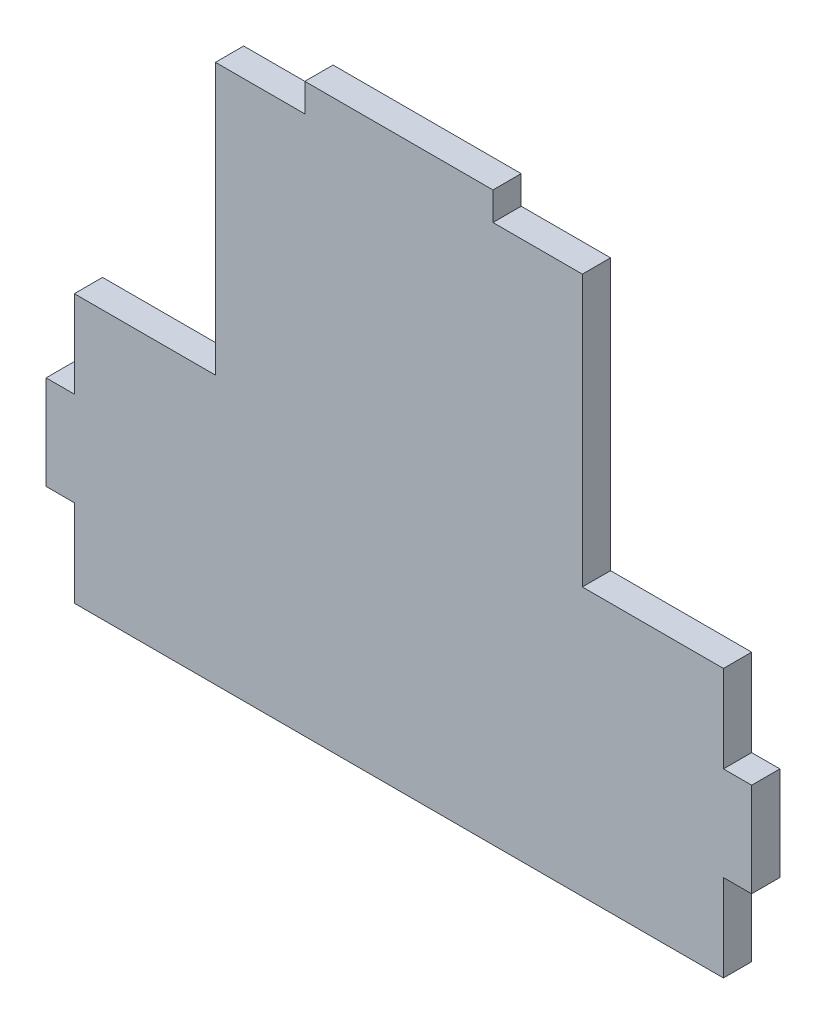
ISO-10303-21;
HEADER;
FILE_DESCRIPTION(('STEP AP214'),'2;1');
FILE_NAME('part.step','',(''),(''),'','','');
FILE_SCHEMA(('AUTOMOTIVE_DESIGN { 1 0 10303 214 1 1 1 1 }'));
ENDSEC;
DATA;
#1=APPLICATION_CONTEXT('core data for automotive mechanical design processes');
#2=APPLICATION_PROTOCOL_DEFINITION('international standard','automotive_design',2000,#1);
#3=PRODUCT_CONTEXT('',#1,'mechanical');
#4=PRODUCT('Part','Part','',(#3));
#5=PRODUCT_RELATED_PRODUCT_CATEGORY('part','',(#4));
#6=PRODUCT_DEFINITION_FORMATION('','',#4);
#7=PRODUCT_DEFINITION_CONTEXT('part definition',#1,'design');
#8=PRODUCT_DEFINITION('design','',#6,#7);
#9=PRODUCT_DEFINITION_SHAPE('','',#8);
#10=(LENGTH_UNIT() NAMED_UNIT(*) SI_UNIT(.MILLI.,.METRE.));
#11=(NAMED_UNIT(*) PLANE_ANGLE_UNIT() SI_UNIT($,.RADIAN.));
#12=(NAMED_UNIT(*) SI_UNIT($,.STERADIAN.) SOLID_ANGLE_UNIT());
#13=UNCERTAINTY_MEASURE_WITH_UNIT(LENGTH_MEASURE(1.E-05),#10,'distance_accuracy_value','');
#14=(GEOMETRIC_REPRESENTATION_CONTEXT(3) GLOBAL_UNCERTAINTY_ASSIGNED_CONTEXT((#13)) GLOBAL_UNIT_ASSIGNED_CONTEXT((#10,
#11,#12)) REPRESENTATION_CONTEXT('',''));
#15=CARTESIAN_POINT('',(0.,0.,0.));
#16=DIRECTION('',(0.,0.,1.));
#17=DIRECTION('',(1.,0.,0.));
#18=AXIS2_PLACEMENT_3D('',#15,#16,#17);
#19=CARTESIAN_POINT('',(18.,-3.,3.));
#20=DIRECTION('',(0.,-1.,0.));
#21=DIRECTION('',(0.,0.,-1.));
#22=AXIS2_PLACEMENT_3D('',#19,#20,#21);
#23=PLANE('',#22);
#24=DIRECTION('',(0.,0.,1.));
#25=VECTOR('',#24,1.);
#26=CARTESIAN_POINT('',(27.5,-3.,0.));
#27=LINE('',#26,#25);
#28=CARTESIAN_POINT('',(27.5,-3.,0.));
#29=VERTEX_POINT('',#28);
#30=CARTESIAN_POINT('',(27.5,-3.,3.));
#31=VERTEX_POINT('',#30);
#32=EDGE_CURVE('E180',#29,#31,#27,.T.);
#33=ORIENTED_EDGE('',*,*,#32,.F.);
#34=DIRECTION('',(-1.,0.,0.));
#35=VECTOR('',#34,1.);
#36=CARTESIAN_POINT('',(18.,-3.,0.));
#37=LINE('',#36,#35);
#38=CARTESIAN_POINT('',(18.,-3.,0.));
#39=VERTEX_POINT('',#38);
#40=EDGE_CURVE('E194',#29,#39,#37,.T.);
#41=ORIENTED_EDGE('',*,*,#40,.T.);
#42=DIRECTION('',(0.,0.,-1.));
#43=VECTOR('',#42,1.);
#44=CARTESIAN_POINT('',(18.,-3.,3.));
#45=LINE('',#44,#43);
#46=CARTESIAN_POINT('',(18.,-3.,3.));
#47=VERTEX_POINT('',#46);
#48=EDGE_CURVE('E217',#47,#39,#45,.T.);
#49=ORIENTED_EDGE('',*,*,#48,.F.);
#50=DIRECTION('',(-1.,0.,0.));
#51=VECTOR('',#50,1.);
#52=CARTESIAN_POINT('',(18.,-3.,3.));
#53=LINE('',#52,#51);
#54=EDGE_CURVE('E196',#31,#47,#53,.T.);
#55=ORIENTED_EDGE('',*,*,#54,.F.);
#56=EDGE_LOOP('',(#33,#41,#49,#55));
#57=FACE_BOUND('',#56,.T.);
#58=ADVANCED_FACE('F39',(#57),#23,.F.);
#59=CARTESIAN_POINT('',(3.,-31.8,3.));
#60=DIRECTION('',(1.,0.,0.));
#61=DIRECTION('',(0.,0.,-1.));
#62=AXIS2_PLACEMENT_3D('',#59,#60,#61);
#63=PLANE('',#62);
#64=DIRECTION('',(0.,0.,1.));
#65=VECTOR('',#64,1.);
#66=CARTESIAN_POINT('',(3.,-51.05,0.));
#67=LINE('',#66,#65);
#68=CARTESIAN_POINT('',(3.,-51.05,0.));
#69=VERTEX_POINT('',#68);
#70=CARTESIAN_POINT('',(3.,-51.05,3.));
#71=VERTEX_POINT('',#70);
#72=EDGE_CURVE('E402',#69,#71,#67,.T.);
#73=ORIENTED_EDGE('',*,*,#72,.F.);
#74=DIRECTION('',(0.,-1.,0.));
#75=VECTOR('',#74,1.);
#76=CARTESIAN_POINT('',(3.,-31.8,0.));
#77=LINE('',#76,#75);
#78=CARTESIAN_POINT('',(3.,-60.3,0.));
#79=VERTEX_POINT('',#78);
#80=EDGE_CURVE('E259',#69,#79,#77,.T.);
#81=ORIENTED_EDGE('',*,*,#80,.T.);
#82=DIRECTION('',(0.,0.,-1.));
#83=VECTOR('',#82,1.);
#84=CARTESIAN_POINT('',(3.,-60.3,3.));
#85=LINE('',#84,#83);
#86=CARTESIAN_POINT('',(3.,-60.3,3.));
#87=VERTEX_POINT('',#86);
#88=EDGE_CURVE('E237',#87,#79,#85,.T.);
#89=ORIENTED_EDGE('',*,*,#88,.F.);
#90=DIRECTION('',(0.,-1.,0.));
#91=VECTOR('',#90,1.);
#92=CARTESIAN_POINT('',(3.,-31.8,3.));
#93=LINE('',#92,#91);
#94=EDGE_CURVE('E330',#71,#87,#93,.T.);
#95=ORIENTED_EDGE('',*,*,#94,.F.);
#96=EDGE_LOOP('',(#73,#81,#89,#95));
#97=FACE_BOUND('',#96,.T.);
#98=ADVANCED_FACE('F357',(#97),#63,.F.);
#99=CARTESIAN_POINT('',(72.,-60.3,3.));
#100=DIRECTION('',(-1.,0.,0.));
#101=DIRECTION('',(0.,0.,1.));
#102=AXIS2_PLACEMENT_3D('',#99,#100,#101);
#103=PLANE('',#102);
#104=DIRECTION('',(0.,0.,1.));
#105=VECTOR('',#104,1.);
#106=CARTESIAN_POINT('',(72.,-41.05,0.));
#107=LINE('',#106,#105);
#108=CARTESIAN_POINT('',(72.,-41.05,0.));
#109=VERTEX_POINT('',#108);
#110=CARTESIAN_POINT('',(72.,-41.05,3.));
#111=VERTEX_POINT('',#110);
#112=EDGE_CURVE('E299',#109,#111,#107,.T.);
#113=ORIENTED_EDGE('',*,*,#112,.F.);
#114=DIRECTION('',(0.,1.,0.));
#115=VECTOR('',#114,1.);
#116=CARTESIAN_POINT('',(72.,-60.3,0.));
#117=LINE('',#116,#115);
#118=CARTESIAN_POINT('',(72.,-31.8,0.));
#119=VERTEX_POINT('',#118);
#120=EDGE_CURVE('E263',#109,#119,#117,.T.);
#121=ORIENTED_EDGE('',*,*,#120,.T.);
#122=DIRECTION('',(0.,0.,-1.));
#123=VECTOR('',#122,1.);
#124=CARTESIAN_POINT('',(72.,-31.8,3.));
#125=LINE('',#124,#123);
#126=CARTESIAN_POINT('',(72.,-31.8,3.));
#127=VERTEX_POINT('',#126);
#128=EDGE_CURVE('E229',#127,#119,#125,.T.);
#129=ORIENTED_EDGE('',*,*,#128,.F.);
#130=DIRECTION('',(0.,1.,0.));
#131=VECTOR('',#130,1.);
#132=CARTESIAN_POINT('',(72.,-60.3,3.));
#133=LINE('',#132,#131);
#134=EDGE_CURVE('E336',#111,#127,#133,.T.);
#135=ORIENTED_EDGE('',*,*,#134,.F.);
#136=EDGE_LOOP('',(#113,#121,#129,#135));
#137=FACE_BOUND('',#136,.T.);
#138=ADVANCED_FACE('F361',(#137),#103,.F.);
#139=CARTESIAN_POINT('',(18.,-3.,3.));
#140=DIRECTION('',(1.,0.,0.));
#141=DIRECTION('',(0.,1.,0.));
#142=AXIS2_PLACEMENT_3D('',#139,#140,#141);
#143=PLANE('',#142);
#144=DIRECTION('',(0.,-1.,0.));
#145=VECTOR('',#144,1.);
#146=CARTESIAN_POINT('',(18.,-3.,0.));
#147=LINE('',#146,#145);
#148=CARTESIAN_POINT('',(18.,-31.8,0.));
#149=VERTEX_POINT('',#148);
#150=EDGE_CURVE('E204',#39,#149,#147,.T.);
#151=ORIENTED_EDGE('',*,*,#150,.T.);
#152=DIRECTION('',(0.,0.,-1.));
#153=VECTOR('',#152,1.);
#154=CARTESIAN_POINT('',(18.,-31.8,3.));
#155=LINE('',#154,#153);
#156=CARTESIAN_POINT('',(18.,-31.8,3.));
#157=VERTEX_POINT('',#156);
#158=EDGE_CURVE('E11',#157,#149,#155,.T.);
#159=ORIENTED_EDGE('',*,*,#158,.F.);
#160=DIRECTION('',(0.,-1.,0.));
#161=VECTOR('',#160,1.);
#162=CARTESIAN_POINT('',(18.,-3.,3.));
#163=LINE('',#162,#161);
#164=EDGE_CURVE('E212',#47,#157,#163,.T.);
#165=ORIENTED_EDGE('',*,*,#164,.F.);
#166=ORIENTED_EDGE('',*,*,#48,.T.);
#167=EDGE_LOOP('',(#151,#159,#165,#166));
#168=FACE_BOUND('',#167,.T.);
#169=ADVANCED_FACE('F41',(#168),#143,.F.);
#170=CARTESIAN_POINT('',(18.,-31.8,3.));
#171=DIRECTION('',(0.,-1.,0.));
#172=DIRECTION('',(0.,0.,-1.));
#173=AXIS2_PLACEMENT_3D('',#170,#171,#172);
#174=PLANE('',#173);
#175=DIRECTION('',(-1.,0.,0.));
#176=VECTOR('',#175,1.);
#177=CARTESIAN_POINT('',(18.,-31.8,0.));
#178=LINE('',#177,#176);
#179=CARTESIAN_POINT('',(3.,-31.8,0.));
#180=VERTEX_POINT('',#179);
#181=EDGE_CURVE('E253',#149,#180,#178,.T.);
#182=ORIENTED_EDGE('',*,*,#181,.T.);
#183=DIRECTION('',(0.,0.,-1.));
#184=VECTOR('',#183,1.);
#185=CARTESIAN_POINT('',(3.,-31.8,3.));
#186=LINE('',#185,#184);
#187=CARTESIAN_POINT('',(3.,-31.8,3.));
#188=VERTEX_POINT('',#187);
#189=EDGE_CURVE('E48',#188,#180,#186,.T.);
#190=ORIENTED_EDGE('',*,*,#189,.F.);
#191=DIRECTION('',(-1.,0.,0.));
#192=VECTOR('',#191,1.);
#193=CARTESIAN_POINT('',(18.,-31.8,3.));
#194=LINE('',#193,#192);
#195=EDGE_CURVE('E327',#157,#188,#194,.T.);
#196=ORIENTED_EDGE('',*,*,#195,.F.);
#197=ORIENTED_EDGE('',*,*,#158,.T.);
#198=EDGE_LOOP('',(#182,#190,#196,#197));
#199=FACE_BOUND('',#198,.T.);
#200=ADVANCED_FACE('F377',(#199),#174,.F.);
#201=CARTESIAN_POINT('',(3.,-41.05,0.));
#202=VERTEX_POINT('',#201);
#203=EDGE_CURVE('E248',#180,#202,#77,.T.);
#204=ORIENTED_EDGE('',*,*,#203,.T.);
#205=DIRECTION('',(0.,0.,1.));
#206=VECTOR('',#205,1.);
#207=CARTESIAN_POINT('',(3.,-41.05,0.));
#208=LINE('',#207,#206);
#209=CARTESIAN_POINT('',(3.,-41.05,3.));
#210=VERTEX_POINT('',#209);
#211=EDGE_CURVE('E412',#202,#210,#208,.T.);
#212=ORIENTED_EDGE('',*,*,#211,.T.);
#213=EDGE_CURVE('E250',#188,#210,#93,.T.);
#214=ORIENTED_EDGE('',*,*,#213,.F.);
#215=ORIENTED_EDGE('',*,*,#189,.T.);
#216=EDGE_LOOP('',(#204,#212,#214,#215));
#217=FACE_BOUND('',#216,.T.);
#218=ADVANCED_FACE('F247',(#217),#63,.F.);
#219=CARTESIAN_POINT('',(3.,-60.3,3.));
#220=DIRECTION('',(0.,1.,0.));
#221=DIRECTION('',(0.,0.,1.));
#222=AXIS2_PLACEMENT_3D('',#219,#220,#221);
#223=PLANE('',#222);
#224=DIRECTION('',(1.,0.,0.));
#225=VECTOR('',#224,1.);
#226=CARTESIAN_POINT('',(3.,-60.3,0.));
#227=LINE('',#226,#225);
#228=CARTESIAN_POINT('',(72.,-60.3,0.));
#229=VERTEX_POINT('',#228);
#230=EDGE_CURVE('E258',#79,#229,#227,.T.);
#231=ORIENTED_EDGE('',*,*,#230,.T.);
#232=DIRECTION('',(0.,0.,-1.));
#233=VECTOR('',#232,1.);
#234=CARTESIAN_POINT('',(72.,-60.3,3.));
#235=LINE('',#234,#233);
#236=CARTESIAN_POINT('',(72.,-60.3,3.));
#237=VERTEX_POINT('',#236);
#238=EDGE_CURVE('E233',#237,#229,#235,.T.);
#239=ORIENTED_EDGE('',*,*,#238,.F.);
#240=DIRECTION('',(1.,0.,0.));
#241=VECTOR('',#240,1.);
#242=CARTESIAN_POINT('',(3.,-60.3,3.));
#243=LINE('',#242,#241);
#244=EDGE_CURVE('E333',#87,#237,#243,.T.);
#245=ORIENTED_EDGE('',*,*,#244,.F.);
#246=ORIENTED_EDGE('',*,*,#88,.T.);
#247=EDGE_LOOP('',(#231,#239,#245,#246));
#248=FACE_BOUND('',#247,.T.);
#249=ADVANCED_FACE('F372',(#248),#223,.F.);
#250=CARTESIAN_POINT('',(72.,-51.05,0.));
#251=VERTEX_POINT('',#250);
#252=EDGE_CURVE('E268',#229,#251,#117,.T.);
#253=ORIENTED_EDGE('',*,*,#252,.T.);
#254=DIRECTION('',(0.,0.,1.));
#255=VECTOR('',#254,1.);
#256=CARTESIAN_POINT('',(72.,-51.05,0.));
#257=LINE('',#256,#255);
#258=CARTESIAN_POINT('',(72.,-51.05,3.));
#259=VERTEX_POINT('',#258);
#260=EDGE_CURVE('E319',#251,#259,#257,.T.);
#261=ORIENTED_EDGE('',*,*,#260,.T.);
#262=EDGE_CURVE('E337',#237,#259,#133,.T.);
#263=ORIENTED_EDGE('',*,*,#262,.F.);
#264=ORIENTED_EDGE('',*,*,#238,.T.);
#265=EDGE_LOOP('',(#253,#261,#263,#264));
#266=FACE_BOUND('',#265,.T.);
#267=ADVANCED_FACE('F369',(#266),#103,.F.);
#268=CARTESIAN_POINT('',(72.,-31.8,3.));
#269=DIRECTION('',(0.,-1.,0.));
#270=DIRECTION('',(0.,0.,-1.));
#271=AXIS2_PLACEMENT_3D('',#268,#269,#270);
#272=PLANE('',#271);
#273=DIRECTION('',(-1.,0.,0.));
#274=VECTOR('',#273,1.);
#275=CARTESIAN_POINT('',(72.,-31.8,0.));
#276=LINE('',#275,#274);
#277=CARTESIAN_POINT('',(57.,-31.8,0.));
#278=VERTEX_POINT('',#277);
#279=EDGE_CURVE('E213',#119,#278,#276,.T.);
#280=ORIENTED_EDGE('',*,*,#279,.T.);
#281=DIRECTION('',(0.,0.,-1.));
#282=VECTOR('',#281,1.);
#283=CARTESIAN_POINT('',(57.,-31.8,3.));
#284=LINE('',#283,#282);
#285=CARTESIAN_POINT('',(57.,-31.8,3.));
#286=VERTEX_POINT('',#285);
#287=EDGE_CURVE('E225',#286,#278,#284,.T.);
#288=ORIENTED_EDGE('',*,*,#287,.F.);
#289=DIRECTION('',(-1.,0.,0.));
#290=VECTOR('',#289,1.);
#291=CARTESIAN_POINT('',(72.,-31.8,3.));
#292=LINE('',#291,#290);
#293=EDGE_CURVE('E340',#127,#286,#292,.T.);
#294=ORIENTED_EDGE('',*,*,#293,.F.);
#295=ORIENTED_EDGE('',*,*,#128,.T.);
#296=EDGE_LOOP('',(#280,#288,#294,#295));
#297=FACE_BOUND('',#296,.T.);
#298=ADVANCED_FACE('F275',(#297),#272,.F.);
#299=CARTESIAN_POINT('',(57.,-31.8,3.));
#300=DIRECTION('',(-1.,0.,0.));
#301=DIRECTION('',(0.,0.,1.));
#302=AXIS2_PLACEMENT_3D('',#299,#300,#301);
#303=PLANE('',#302);
#304=DIRECTION('',(0.,1.,0.));
#305=VECTOR('',#304,1.);
#306=CARTESIAN_POINT('',(57.,-31.8,0.));
#307=LINE('',#306,#305);
#308=CARTESIAN_POINT('',(57.,-3.,0.));
#309=VERTEX_POINT('',#308);
#310=EDGE_CURVE('E207',#278,#309,#307,.T.);
#311=ORIENTED_EDGE('',*,*,#310,.T.);
#312=DIRECTION('',(0.,0.,-1.));
#313=VECTOR('',#312,1.);
#314=CARTESIAN_POINT('',(57.,-3.,3.));
#315=LINE('',#314,#313);
#316=CARTESIAN_POINT('',(57.,-3.,3.));
#317=VERTEX_POINT('',#316);
#318=EDGE_CURVE('E220',#317,#309,#315,.T.);
#319=ORIENTED_EDGE('',*,*,#318,.F.);
#320=DIRECTION('',(0.,1.,0.));
#321=VECTOR('',#320,1.);
#322=CARTESIAN_POINT('',(57.,-31.8,3.));
#323=LINE('',#322,#321);
#324=EDGE_CURVE('E284',#286,#317,#323,.T.);
#325=ORIENTED_EDGE('',*,*,#324,.F.);
#326=ORIENTED_EDGE('',*,*,#287,.T.);
#327=EDGE_LOOP('',(#311,#319,#325,#326));
#328=FACE_BOUND('',#327,.T.);
#329=ADVANCED_FACE('F282',(#328),#303,.F.);
#330=CARTESIAN_POINT('',(47.5,-3.,0.));
#331=VERTEX_POINT('',#330);
#332=EDGE_CURVE('E206',#309,#331,#37,.T.);
#333=ORIENTED_EDGE('',*,*,#332,.T.);
#334=DIRECTION('',(0.,0.,1.));
#335=VECTOR('',#334,1.);
#336=CARTESIAN_POINT('',(47.5,-3.,0.));
#337=LINE('',#336,#335);
#338=CARTESIAN_POINT('',(47.5,-3.,3.));
#339=VERTEX_POINT('',#338);
#340=EDGE_CURVE('E198',#331,#339,#337,.T.);
#341=ORIENTED_EDGE('',*,*,#340,.T.);
#342=EDGE_CURVE('E221',#317,#339,#53,.T.);
#343=ORIENTED_EDGE('',*,*,#342,.F.);
#344=ORIENTED_EDGE('',*,*,#318,.T.);
#345=EDGE_LOOP('',(#333,#341,#343,#344));
#346=FACE_BOUND('',#345,.T.);
#347=ADVANCED_FACE('F289',(#346),#23,.F.);
#348=CARTESIAN_POINT('',(0.,0.,3.));
#349=DIRECTION('',(0.,0.,-1.));
#350=DIRECTION('',(-1.,0.,0.));
#351=AXIS2_PLACEMENT_3D('',#348,#349,#350);
#352=PLANE('',#351);
#353=ORIENTED_EDGE('',*,*,#164,.T.);
#354=ORIENTED_EDGE('',*,*,#195,.T.);
#355=ORIENTED_EDGE('',*,*,#213,.T.);
#356=DIRECTION('',(-1.,0.,0.));
#357=VECTOR('',#356,1.);
#358=CARTESIAN_POINT('',(3.,-41.05,3.));
#359=LINE('',#358,#357);
#360=CARTESIAN_POINT('',(0.,-41.05,3.));
#361=VERTEX_POINT('',#360);
#362=EDGE_CURVE('E63',#210,#361,#359,.T.);
#363=ORIENTED_EDGE('',*,*,#362,.T.);
#364=DIRECTION('',(0.,-1.,0.));
#365=VECTOR('',#364,1.);
#366=CARTESIAN_POINT('',(0.,-41.05,3.));
#367=LINE('',#366,#365);
#368=CARTESIAN_POINT('',(0.,-51.05,3.));
#369=VERTEX_POINT('',#368);
#370=EDGE_CURVE('E386',#361,#369,#367,.T.);
#371=ORIENTED_EDGE('',*,*,#370,.T.);
#372=DIRECTION('',(1.,0.,0.));
#373=VECTOR('',#372,1.);
#374=CARTESIAN_POINT('',(3.,-51.05,3.));
#375=LINE('',#374,#373);
#376=EDGE_CURVE('E392',#369,#71,#375,.T.);
#377=ORIENTED_EDGE('',*,*,#376,.T.);
#378=ORIENTED_EDGE('',*,*,#94,.T.);
#379=ORIENTED_EDGE('',*,*,#244,.T.);
#380=ORIENTED_EDGE('',*,*,#262,.T.);
#381=DIRECTION('',(1.,0.,0.));
#382=VECTOR('',#381,1.);
#383=CARTESIAN_POINT('',(75.,-51.05,3.));
#384=LINE('',#383,#382);
#385=CARTESIAN_POINT('',(75.,-51.05,3.));
#386=VERTEX_POINT('',#385);
#387=EDGE_CURVE('E405',#259,#386,#384,.T.);
#388=ORIENTED_EDGE('',*,*,#387,.T.);
#389=DIRECTION('',(0.,1.,0.));
#390=VECTOR('',#389,1.);
#391=CARTESIAN_POINT('',(75.,-41.05,3.));
#392=LINE('',#391,#390);
#393=CARTESIAN_POINT('',(75.,-41.05,3.));
#394=VERTEX_POINT('',#393);
#395=EDGE_CURVE('E427',#386,#394,#392,.T.);
#396=ORIENTED_EDGE('',*,*,#395,.T.);
#397=DIRECTION('',(-1.,0.,0.));
#398=VECTOR('',#397,1.);
#399=CARTESIAN_POINT('',(72.,-41.05,3.));
#400=LINE('',#399,#398);
#401=EDGE_CURVE('E314',#394,#111,#400,.T.);
#402=ORIENTED_EDGE('',*,*,#401,.T.);
#403=ORIENTED_EDGE('',*,*,#134,.T.);
#404=ORIENTED_EDGE('',*,*,#293,.T.);
#405=ORIENTED_EDGE('',*,*,#324,.T.);
#406=ORIENTED_EDGE('',*,*,#342,.T.);
#407=DIRECTION('',(0.,1.,0.));
#408=VECTOR('',#407,1.);
#409=CARTESIAN_POINT('',(47.5,-3.,3.));
#410=LINE('',#409,#408);
#411=CARTESIAN_POINT('',(47.5,0.,3.));
#412=VERTEX_POINT('',#411);
#413=EDGE_CURVE('E55',#339,#412,#410,.T.);
#414=ORIENTED_EDGE('',*,*,#413,.T.);
#415=DIRECTION('',(-1.,0.,0.));
#416=VECTOR('',#415,1.);
#417=CARTESIAN_POINT('',(27.5,0.,3.));
#418=LINE('',#417,#416);
#419=CARTESIAN_POINT('',(27.5,0.,3.));
#420=VERTEX_POINT('',#419);
#421=EDGE_CURVE('E189',#412,#420,#418,.T.);
#422=ORIENTED_EDGE('',*,*,#421,.T.);
#423=DIRECTION('',(0.,-1.,0.));
#424=VECTOR('',#423,1.);
#425=CARTESIAN_POINT('',(27.5,-3.,3.));
#426=LINE('',#425,#424);
#427=EDGE_CURVE('E472',#420,#31,#426,.T.);
#428=ORIENTED_EDGE('',*,*,#427,.T.);
#429=ORIENTED_EDGE('',*,*,#54,.T.);
#430=EDGE_LOOP('',(#353,#354,#355,#363,#371,#377,#378,#379,#380,#388,#396,#402,#403,#404,#405,
#406,#414,#422,#428,#429));
#431=FACE_BOUND('',#430,.T.);
#432=ADVANCED_FACE('F343',(#431),#352,.F.);
#433=CARTESIAN_POINT('',(0.,0.,0.));
#434=DIRECTION('',(0.,0.,-1.));
#435=DIRECTION('',(-1.,0.,0.));
#436=AXIS2_PLACEMENT_3D('',#433,#434,#435);
#437=PLANE('',#436);
#438=ORIENTED_EDGE('',*,*,#150,.F.);
#439=ORIENTED_EDGE('',*,*,#40,.F.);
#440=DIRECTION('',(0.,-1.,0.));
#441=VECTOR('',#440,1.);
#442=CARTESIAN_POINT('',(27.5,-3.,0.));
#443=LINE('',#442,#441);
#444=CARTESIAN_POINT('',(27.5,0.,0.));
#445=VERTEX_POINT('',#444);
#446=EDGE_CURVE('E176',#445,#29,#443,.T.);
#447=ORIENTED_EDGE('',*,*,#446,.F.);
#448=DIRECTION('',(-1.,0.,0.));
#449=VECTOR('',#448,1.);
#450=CARTESIAN_POINT('',(27.5,0.,0.));
#451=LINE('',#450,#449);
#452=CARTESIAN_POINT('',(47.5,0.,0.));
#453=VERTEX_POINT('',#452);
#454=EDGE_CURVE('E199',#453,#445,#451,.T.);
#455=ORIENTED_EDGE('',*,*,#454,.F.);
#456=DIRECTION('',(0.,1.,0.));
#457=VECTOR('',#456,1.);
#458=CARTESIAN_POINT('',(47.5,-3.,0.));
#459=LINE('',#458,#457);
#460=EDGE_CURVE('E188',#331,#453,#459,.T.);
#461=ORIENTED_EDGE('',*,*,#460,.F.);
#462=ORIENTED_EDGE('',*,*,#332,.F.);
#463=ORIENTED_EDGE('',*,*,#310,.F.);
#464=ORIENTED_EDGE('',*,*,#279,.F.);
#465=ORIENTED_EDGE('',*,*,#120,.F.);
#466=DIRECTION('',(-1.,0.,0.));
#467=VECTOR('',#466,1.);
#468=CARTESIAN_POINT('',(72.,-41.05,0.));
#469=LINE('',#468,#467);
#470=CARTESIAN_POINT('',(75.,-41.05,0.));
#471=VERTEX_POINT('',#470);
#472=EDGE_CURVE('E323',#471,#109,#469,.T.);
#473=ORIENTED_EDGE('',*,*,#472,.F.);
#474=DIRECTION('',(0.,1.,0.));
#475=VECTOR('',#474,1.);
#476=CARTESIAN_POINT('',(75.,-41.05,0.));
#477=LINE('',#476,#475);
#478=CARTESIAN_POINT('',(75.,-51.05,0.));
#479=VERTEX_POINT('',#478);
#480=EDGE_CURVE('E419',#479,#471,#477,.T.);
#481=ORIENTED_EDGE('',*,*,#480,.F.);
#482=DIRECTION('',(1.,0.,0.));
#483=VECTOR('',#482,1.);
#484=CARTESIAN_POINT('',(75.,-51.05,0.));
#485=LINE('',#484,#483);
#486=EDGE_CURVE('E415',#251,#479,#485,.T.);
#487=ORIENTED_EDGE('',*,*,#486,.F.);
#488=ORIENTED_EDGE('',*,*,#252,.F.);
#489=ORIENTED_EDGE('',*,*,#230,.F.);
#490=ORIENTED_EDGE('',*,*,#80,.F.);
#491=DIRECTION('',(1.,0.,0.));
#492=VECTOR('',#491,1.);
#493=CARTESIAN_POINT('',(3.,-51.05,0.));
#494=LINE('',#493,#492);
#495=CARTESIAN_POINT('',(0.,-51.05,0.));
#496=VERTEX_POINT('',#495);
#497=EDGE_CURVE('E397',#496,#69,#494,.T.);
#498=ORIENTED_EDGE('',*,*,#497,.F.);
#499=DIRECTION('',(0.,-1.,0.));
#500=VECTOR('',#499,1.);
#501=CARTESIAN_POINT('',(0.,-41.05,0.));
#502=LINE('',#501,#500);
#503=CARTESIAN_POINT('',(0.,-41.05,0.));
#504=VERTEX_POINT('',#503);
#505=EDGE_CURVE('E455',#504,#496,#502,.T.);
#506=ORIENTED_EDGE('',*,*,#505,.F.);
#507=DIRECTION('',(-1.,0.,0.));
#508=VECTOR('',#507,1.);
#509=CARTESIAN_POINT('',(3.,-41.05,0.));
#510=LINE('',#509,#508);
#511=EDGE_CURVE('E256',#202,#504,#510,.T.);
#512=ORIENTED_EDGE('',*,*,#511,.F.);
#513=ORIENTED_EDGE('',*,*,#203,.F.);
#514=ORIENTED_EDGE('',*,*,#181,.F.);
#515=EDGE_LOOP('',(#438,#439,#447,#455,#461,#462,#463,#464,#465,#473,#481,#487,#488,#489,#490,
#498,#506,#512,#513,#514));
#516=FACE_BOUND('',#515,.T.);
#517=ADVANCED_FACE('F202',(#516),#437,.T.);
#518=CARTESIAN_POINT('',(72.,-41.05,0.));
#519=DIRECTION('',(0.,1.,0.));
#520=DIRECTION('',(0.,0.,1.));
#521=AXIS2_PLACEMENT_3D('',#518,#519,#520);
#522=PLANE('',#521);
#523=ORIENTED_EDGE('',*,*,#401,.F.);
#524=DIRECTION('',(0.,0.,1.));
#525=VECTOR('',#524,1.);
#526=CARTESIAN_POINT('',(75.,-41.05,0.));
#527=LINE('',#526,#525);
#528=EDGE_CURVE('E304',#471,#394,#527,.T.);
#529=ORIENTED_EDGE('',*,*,#528,.F.);
#530=ORIENTED_EDGE('',*,*,#472,.T.);
#531=ORIENTED_EDGE('',*,*,#112,.T.);
#532=EDGE_LOOP('',(#523,#529,#530,#531));
#533=FACE_BOUND('',#532,.T.);
#534=ADVANCED_FACE('F351',(#533),#522,.T.);
#535=CARTESIAN_POINT('',(75.,-41.05,0.));
#536=DIRECTION('',(1.,0.,0.));
#537=DIRECTION('',(0.,0.,-1.));
#538=AXIS2_PLACEMENT_3D('',#535,#536,#537);
#539=PLANE('',#538);
#540=ORIENTED_EDGE('',*,*,#395,.F.);
#541=DIRECTION('',(0.,0.,1.));
#542=VECTOR('',#541,1.);
#543=CARTESIAN_POINT('',(75.,-51.05,0.));
#544=LINE('',#543,#542);
#545=EDGE_CURVE('E311',#479,#386,#544,.T.);
#546=ORIENTED_EDGE('',*,*,#545,.F.);
#547=ORIENTED_EDGE('',*,*,#480,.T.);
#548=ORIENTED_EDGE('',*,*,#528,.T.);
#549=EDGE_LOOP('',(#540,#546,#547,#548));
#550=FACE_BOUND('',#549,.T.);
#551=ADVANCED_FACE('F450',(#550),#539,.T.);
#552=CARTESIAN_POINT('',(75.,-51.05,0.));
#553=DIRECTION('',(0.,-1.,0.));
#554=DIRECTION('',(0.,0.,-1.));
#555=AXIS2_PLACEMENT_3D('',#552,#553,#554);
#556=PLANE('',#555);
#557=ORIENTED_EDGE('',*,*,#387,.F.);
#558=ORIENTED_EDGE('',*,*,#260,.F.);
#559=ORIENTED_EDGE('',*,*,#486,.T.);
#560=ORIENTED_EDGE('',*,*,#545,.T.);
#561=EDGE_LOOP('',(#557,#558,#559,#560));
#562=FACE_BOUND('',#561,.T.);
#563=ADVANCED_FACE('F446',(#562),#556,.T.);
#564=CARTESIAN_POINT('',(3.,-51.05,0.));
#565=DIRECTION('',(0.,-1.,0.));
#566=DIRECTION('',(0.,0.,-1.));
#567=AXIS2_PLACEMENT_3D('',#564,#565,#566);
#568=PLANE('',#567);
#569=ORIENTED_EDGE('',*,*,#376,.F.);
#570=DIRECTION('',(0.,0.,1.));
#571=VECTOR('',#570,1.);
#572=CARTESIAN_POINT('',(0.,-51.05,0.));
#573=LINE('',#572,#571);
#574=EDGE_CURVE('E406',#496,#369,#573,.T.);
#575=ORIENTED_EDGE('',*,*,#574,.F.);
#576=ORIENTED_EDGE('',*,*,#497,.T.);
#577=ORIENTED_EDGE('',*,*,#72,.T.);
#578=EDGE_LOOP('',(#569,#575,#576,#577));
#579=FACE_BOUND('',#578,.T.);
#580=ADVANCED_FACE('F492',(#579),#568,.T.);
#581=CARTESIAN_POINT('',(0.,-41.05,0.));
#582=DIRECTION('',(-1.,0.,0.));
#583=DIRECTION('',(0.,-1.,0.));
#584=AXIS2_PLACEMENT_3D('',#581,#582,#583);
#585=PLANE('',#584);
#586=ORIENTED_EDGE('',*,*,#370,.F.);
#587=DIRECTION('',(0.,0.,1.));
#588=VECTOR('',#587,1.);
#589=CARTESIAN_POINT('',(0.,-41.05,0.));
#590=LINE('',#589,#588);
#591=EDGE_CURVE('E409',#504,#361,#590,.T.);
#592=ORIENTED_EDGE('',*,*,#591,.F.);
#593=ORIENTED_EDGE('',*,*,#505,.T.);
#594=ORIENTED_EDGE('',*,*,#574,.T.);
#595=EDGE_LOOP('',(#586,#592,#593,#594));
#596=FACE_BOUND('',#595,.T.);
#597=ADVANCED_FACE('F495',(#596),#585,.T.);
#598=CARTESIAN_POINT('',(3.,-41.05,0.));
#599=DIRECTION('',(0.,1.,0.));
#600=DIRECTION('',(0.,0.,1.));
#601=AXIS2_PLACEMENT_3D('',#598,#599,#600);
#602=PLANE('',#601);
#603=ORIENTED_EDGE('',*,*,#362,.F.);
#604=ORIENTED_EDGE('',*,*,#211,.F.);
#605=ORIENTED_EDGE('',*,*,#511,.T.);
#606=ORIENTED_EDGE('',*,*,#591,.T.);
#607=EDGE_LOOP('',(#603,#604,#605,#606));
#608=FACE_BOUND('',#607,.T.);
#609=ADVANCED_FACE('F489',(#608),#602,.T.);
#610=CARTESIAN_POINT('',(27.5,-3.,0.));
#611=DIRECTION('',(-1.,0.,0.));
#612=DIRECTION('',(0.,0.,1.));
#613=AXIS2_PLACEMENT_3D('',#610,#611,#612);
#614=PLANE('',#613);
#615=ORIENTED_EDGE('',*,*,#427,.F.);
#616=DIRECTION('',(0.,0.,1.));
#617=VECTOR('',#616,1.);
#618=CARTESIAN_POINT('',(27.5,0.,0.));
#619=LINE('',#618,#617);
#620=EDGE_CURVE('E182',#445,#420,#619,.T.);
#621=ORIENTED_EDGE('',*,*,#620,.F.);
#622=ORIENTED_EDGE('',*,*,#446,.T.);
#623=ORIENTED_EDGE('',*,*,#32,.T.);
#624=EDGE_LOOP('',(#615,#621,#622,#623));
#625=FACE_BOUND('',#624,.T.);
#626=ADVANCED_FACE('F179',(#625),#614,.T.);
#627=CARTESIAN_POINT('',(27.5,0.,0.));
#628=DIRECTION('',(0.,1.,0.));
#629=DIRECTION('',(0.,0.,1.));
#630=AXIS2_PLACEMENT_3D('',#627,#628,#629);
#631=PLANE('',#630);
#632=ORIENTED_EDGE('',*,*,#421,.F.);
#633=DIRECTION('',(0.,0.,1.));
#634=VECTOR('',#633,1.);
#635=CARTESIAN_POINT('',(47.5,0.,0.));
#636=LINE('',#635,#634);
#637=EDGE_CURVE('E394',#453,#412,#636,.T.);
#638=ORIENTED_EDGE('',*,*,#637,.F.);
#639=ORIENTED_EDGE('',*,*,#454,.T.);
#640=ORIENTED_EDGE('',*,*,#620,.T.);
#641=EDGE_LOOP('',(#632,#638,#639,#640));
#642=FACE_BOUND('',#641,.T.);
#643=ADVANCED_FACE('F481',(#642),#631,.T.);
#644=CARTESIAN_POINT('',(47.5,-3.,0.));
#645=DIRECTION('',(1.,0.,0.));
#646=DIRECTION('',(0.,0.,-1.));
#647=AXIS2_PLACEMENT_3D('',#644,#645,#646);
#648=PLANE('',#647);
#649=ORIENTED_EDGE('',*,*,#413,.F.);
#650=ORIENTED_EDGE('',*,*,#340,.F.);
#651=ORIENTED_EDGE('',*,*,#460,.T.);
#652=ORIENTED_EDGE('',*,*,#637,.T.);
#653=EDGE_LOOP('',(#649,#650,#651,#652));
#654=FACE_BOUND('',#653,.T.);
#655=ADVANCED_FACE('F478',(#654),#648,.T.);
#656=CLOSED_SHELL('',(#58,#98,#138,#169,#200,#218,#249,#267,#298,#329,#347,#432,#517,#534,#551,
#563,#580,#597,#609,#626,#643,#655));
#657=MANIFOLD_SOLID_BREP('B2',#656);
#658=ADVANCED_BREP_SHAPE_REPRESENTATION('',(#18,#657),#14);
#659=SHAPE_DEFINITION_REPRESENTATION(#9,#658);
ENDSEC;
END-ISO-10303-21;
